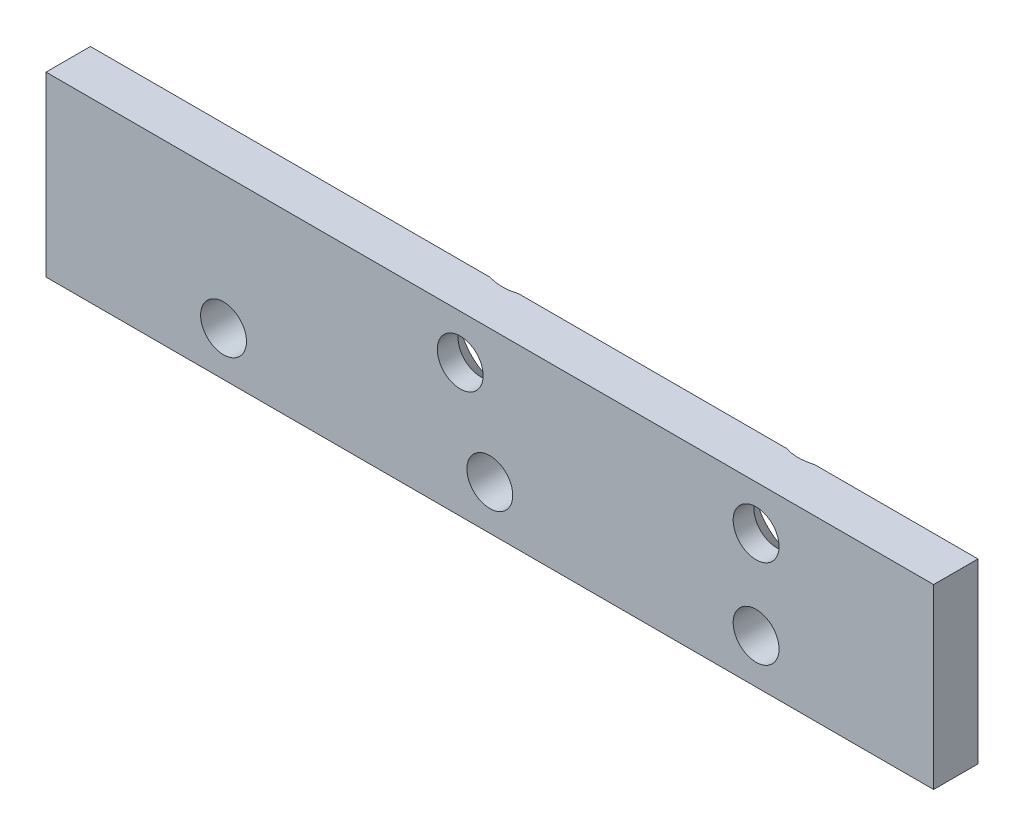
ISO-10303-21;
HEADER;
FILE_DESCRIPTION(('STEP AP214'),'2;1');
FILE_NAME('part.step','',(''),(''),'','','');
FILE_SCHEMA(('AUTOMOTIVE_DESIGN { 1 0 10303 214 1 1 1 1 }'));
ENDSEC;
DATA;
#1=APPLICATION_CONTEXT('core data for automotive mechanical design processes');
#2=APPLICATION_PROTOCOL_DEFINITION('international standard','automotive_design',2000,#1);
#3=PRODUCT_CONTEXT('',#1,'mechanical');
#4=PRODUCT('Part','Part','',(#3));
#5=PRODUCT_RELATED_PRODUCT_CATEGORY('part','',(#4));
#6=PRODUCT_DEFINITION_FORMATION('','',#4);
#7=PRODUCT_DEFINITION_CONTEXT('part definition',#1,'design');
#8=PRODUCT_DEFINITION('design','',#6,#7);
#9=PRODUCT_DEFINITION_SHAPE('','',#8);
#10=(LENGTH_UNIT() NAMED_UNIT(*) SI_UNIT(.MILLI.,.METRE.));
#11=(NAMED_UNIT(*) PLANE_ANGLE_UNIT() SI_UNIT($,.RADIAN.));
#12=(NAMED_UNIT(*) SI_UNIT($,.STERADIAN.) SOLID_ANGLE_UNIT());
#13=UNCERTAINTY_MEASURE_WITH_UNIT(LENGTH_MEASURE(1.E-05),#10,'distance_accuracy_value','');
#14=(GEOMETRIC_REPRESENTATION_CONTEXT(3) GLOBAL_UNCERTAINTY_ASSIGNED_CONTEXT((#13)) GLOBAL_UNIT_ASSIGNED_CONTEXT((#10,
#11,#12)) REPRESENTATION_CONTEXT('',''));
#15=CARTESIAN_POINT('',(0.,0.,0.));
#16=DIRECTION('',(0.,0.,1.));
#17=DIRECTION('',(1.,0.,0.));
#18=AXIS2_PLACEMENT_3D('',#15,#16,#17);
#19=CARTESIAN_POINT('',(0.,0.,3.));
#20=DIRECTION('',(0.,0.,1.));
#21=DIRECTION('',(1.,0.,0.));
#22=AXIS2_PLACEMENT_3D('',#19,#20,#21);
#23=PLANE('',#22);
#24=CARTESIAN_POINT('',(18.,-3.,3.));
#25=DIRECTION('',(0.,0.,1.));
#26=DIRECTION('',(1.,0.,0.));
#27=AXIS2_PLACEMENT_3D('',#24,#25,#26);
#28=CIRCLE('',#27,1.55);
#29=CARTESIAN_POINT('',(19.55,-3.,3.));
#30=VERTEX_POINT('',#29);
#31=EDGE_CURVE('E242',#30,#30,#28,.T.);
#32=ORIENTED_EDGE('',*,*,#31,.F.);
#33=EDGE_LOOP('',(#32));
#34=FACE_BOUND('',#33,.T.);
#35=CARTESIAN_POINT('',(-2.00000000000001,3.,3.));
#36=DIRECTION('',(0.,0.,1.));
#37=DIRECTION('',(1.,0.,0.));
#38=AXIS2_PLACEMENT_3D('',#35,#36,#37);
#39=CIRCLE('',#38,1.55);
#40=CARTESIAN_POINT('',(-0.450000000000005,3.,3.));
#41=VERTEX_POINT('',#40);
#42=EDGE_CURVE('E219',#41,#41,#39,.T.);
#43=ORIENTED_EDGE('',*,*,#42,.F.);
#44=EDGE_LOOP('',(#43));
#45=FACE_BOUND('',#44,.T.);
#46=DIRECTION('',(0.,1.,0.));
#47=VECTOR('',#46,1.);
#48=CARTESIAN_POINT('',(30.,6.,3.));
#49=LINE('',#48,#47);
#50=CARTESIAN_POINT('',(30.,-6.,3.));
#51=VERTEX_POINT('',#50);
#52=CARTESIAN_POINT('',(30.,6.,3.));
#53=VERTEX_POINT('',#52);
#54=EDGE_CURVE('E108',#51,#53,#49,.T.);
#55=ORIENTED_EDGE('',*,*,#54,.T.);
#56=DIRECTION('',(-1.,0.,0.));
#57=VECTOR('',#56,1.);
#58=CARTESIAN_POINT('',(-30.,6.,3.));
#59=LINE('',#58,#57);
#60=CARTESIAN_POINT('',(-30.,6.,3.));
#61=VERTEX_POINT('',#60);
#62=EDGE_CURVE('E95',#53,#61,#59,.T.);
#63=ORIENTED_EDGE('',*,*,#62,.T.);
#64=DIRECTION('',(0.,-1.,0.));
#65=VECTOR('',#64,1.);
#66=CARTESIAN_POINT('',(-30.,6.,3.));
#67=LINE('',#66,#65);
#68=CARTESIAN_POINT('',(-30.,-6.,3.));
#69=VERTEX_POINT('',#68);
#70=EDGE_CURVE('E107',#61,#69,#67,.T.);
#71=ORIENTED_EDGE('',*,*,#70,.T.);
#72=DIRECTION('',(1.,0.,0.));
#73=VECTOR('',#72,1.);
#74=CARTESIAN_POINT('',(-30.,-6.,3.));
#75=LINE('',#74,#73);
#76=EDGE_CURVE('E113',#69,#51,#75,.T.);
#77=ORIENTED_EDGE('',*,*,#76,.T.);
#78=EDGE_LOOP('',(#55,#63,#71,#77));
#79=FACE_BOUND('',#78,.T.);
#80=CARTESIAN_POINT('',(18.,3.,3.));
#81=DIRECTION('',(0.,0.,1.));
#82=DIRECTION('',(1.,0.,0.));
#83=AXIS2_PLACEMENT_3D('',#80,#81,#82);
#84=CIRCLE('',#83,1.55);
#85=CARTESIAN_POINT('',(19.55,3.,3.));
#86=VERTEX_POINT('',#85);
#87=EDGE_CURVE('E212',#86,#86,#84,.T.);
#88=ORIENTED_EDGE('',*,*,#87,.F.);
#89=EDGE_LOOP('',(#88));
#90=FACE_BOUND('',#89,.T.);
#91=CARTESIAN_POINT('',(0.,-3.,3.));
#92=DIRECTION('',(0.,0.,1.));
#93=DIRECTION('',(1.,0.,0.));
#94=AXIS2_PLACEMENT_3D('',#91,#92,#93);
#95=CIRCLE('',#94,1.55);
#96=CARTESIAN_POINT('',(1.54999999999999,-3.,3.));
#97=VERTEX_POINT('',#96);
#98=EDGE_CURVE('E237',#97,#97,#95,.T.);
#99=ORIENTED_EDGE('',*,*,#98,.F.);
#100=EDGE_LOOP('',(#99));
#101=FACE_BOUND('',#100,.T.);
#102=CARTESIAN_POINT('',(-18.,-3.,3.));
#103=DIRECTION('',(0.,0.,1.));
#104=DIRECTION('',(1.,0.,0.));
#105=AXIS2_PLACEMENT_3D('',#102,#103,#104);
#106=CIRCLE('',#105,1.55);
#107=CARTESIAN_POINT('',(-16.45,-3.,3.));
#108=VERTEX_POINT('',#107);
#109=EDGE_CURVE('E250',#108,#108,#106,.T.);
#110=ORIENTED_EDGE('',*,*,#109,.F.);
#111=EDGE_LOOP('',(#110));
#112=FACE_BOUND('',#111,.T.);
#113=ADVANCED_FACE('F41',(#34,#45,#79,#90,#101,#112),#23,.T.);
#114=CARTESIAN_POINT('',(0.,0.,0.));
#115=DIRECTION('',(0.,0.,1.));
#116=DIRECTION('',(1.,0.,0.));
#117=AXIS2_PLACEMENT_3D('',#114,#115,#116);
#118=PLANE('',#117);
#119=DIRECTION('',(-1.,0.,0.));
#120=VECTOR('',#119,1.);
#121=CARTESIAN_POINT('',(-30.,6.,0.));
#122=LINE('',#121,#120);
#123=CARTESIAN_POINT('',(-2.96046863561493,6.,0.));
#124=VERTEX_POINT('',#123);
#125=CARTESIAN_POINT('',(-30.,6.,0.));
#126=VERTEX_POINT('',#125);
#127=EDGE_CURVE('E211',#124,#126,#122,.T.);
#128=ORIENTED_EDGE('',*,*,#127,.F.);
#129=CARTESIAN_POINT('',(-2.00000000000001,3.,0.));
#130=DIRECTION('',(0.,0.,1.));
#131=DIRECTION('',(1.,0.,0.));
#132=AXIS2_PLACEMENT_3D('',#129,#130,#131);
#133=CIRCLE('',#132,3.15);
#134=CARTESIAN_POINT('',(-1.03953136438508,6.,0.));
#135=VERTEX_POINT('',#134);
#136=EDGE_CURVE('E129',#124,#135,#133,.T.);
#137=ORIENTED_EDGE('',*,*,#136,.T.);
#138=CARTESIAN_POINT('',(17.0395313643851,6.,0.));
#139=VERTEX_POINT('',#138);
#140=EDGE_CURVE('E216',#139,#135,#122,.T.);
#141=ORIENTED_EDGE('',*,*,#140,.F.);
#142=CARTESIAN_POINT('',(18.,3.,0.));
#143=DIRECTION('',(0.,0.,1.));
#144=DIRECTION('',(1.,0.,0.));
#145=AXIS2_PLACEMENT_3D('',#142,#143,#144);
#146=CIRCLE('',#145,3.15);
#147=CARTESIAN_POINT('',(18.9604686356149,6.,0.));
#148=VERTEX_POINT('',#147);
#149=EDGE_CURVE('E124',#139,#148,#146,.T.);
#150=ORIENTED_EDGE('',*,*,#149,.T.);
#151=CARTESIAN_POINT('',(30.,6.,0.));
#152=VERTEX_POINT('',#151);
#153=EDGE_CURVE('E209',#152,#148,#122,.T.);
#154=ORIENTED_EDGE('',*,*,#153,.F.);
#155=DIRECTION('',(0.,1.,0.));
#156=VECTOR('',#155,1.);
#157=CARTESIAN_POINT('',(30.,6.,0.));
#158=LINE('',#157,#156);
#159=CARTESIAN_POINT('',(30.,-6.,0.));
#160=VERTEX_POINT('',#159);
#161=EDGE_CURVE('E122',#160,#152,#158,.T.);
#162=ORIENTED_EDGE('',*,*,#161,.F.);
#163=DIRECTION('',(1.,0.,0.));
#164=VECTOR('',#163,1.);
#165=CARTESIAN_POINT('',(-30.,-6.,0.));
#166=LINE('',#165,#164);
#167=CARTESIAN_POINT('',(-30.,-6.,0.));
#168=VERTEX_POINT('',#167);
#169=EDGE_CURVE('E118',#168,#160,#166,.T.);
#170=ORIENTED_EDGE('',*,*,#169,.F.);
#171=DIRECTION('',(0.,-1.,0.));
#172=VECTOR('',#171,1.);
#173=CARTESIAN_POINT('',(-30.,6.,0.));
#174=LINE('',#173,#172);
#175=EDGE_CURVE('E204',#126,#168,#174,.T.);
#176=ORIENTED_EDGE('',*,*,#175,.F.);
#177=EDGE_LOOP('',(#128,#137,#141,#150,#154,#162,#170,#176));
#178=FACE_BOUND('',#177,.T.);
#179=CARTESIAN_POINT('',(0.,-3.,0.));
#180=DIRECTION('',(0.,0.,1.));
#181=DIRECTION('',(1.,0.,0.));
#182=AXIS2_PLACEMENT_3D('',#179,#180,#181);
#183=CIRCLE('',#182,1.55);
#184=CARTESIAN_POINT('',(1.54999999999999,-3.,0.));
#185=VERTEX_POINT('',#184);
#186=EDGE_CURVE('E238',#185,#185,#183,.T.);
#187=ORIENTED_EDGE('',*,*,#186,.T.);
#188=EDGE_LOOP('',(#187));
#189=FACE_BOUND('',#188,.T.);
#190=CARTESIAN_POINT('',(18.,-3.,0.));
#191=DIRECTION('',(0.,0.,1.));
#192=DIRECTION('',(1.,0.,0.));
#193=AXIS2_PLACEMENT_3D('',#190,#191,#192);
#194=CIRCLE('',#193,1.55);
#195=CARTESIAN_POINT('',(19.55,-3.,0.));
#196=VERTEX_POINT('',#195);
#197=EDGE_CURVE('E246',#196,#196,#194,.T.);
#198=ORIENTED_EDGE('',*,*,#197,.T.);
#199=EDGE_LOOP('',(#198));
#200=FACE_BOUND('',#199,.T.);
#201=CARTESIAN_POINT('',(-18.,-3.,0.));
#202=DIRECTION('',(0.,0.,1.));
#203=DIRECTION('',(1.,0.,0.));
#204=AXIS2_PLACEMENT_3D('',#201,#202,#203);
#205=CIRCLE('',#204,1.55);
#206=CARTESIAN_POINT('',(-16.45,-3.,0.));
#207=VERTEX_POINT('',#206);
#208=EDGE_CURVE('E254',#207,#207,#205,.T.);
#209=ORIENTED_EDGE('',*,*,#208,.T.);
#210=EDGE_LOOP('',(#209));
#211=FACE_BOUND('',#210,.T.);
#212=ADVANCED_FACE('F157',(#178,#189,#200,#211),#118,.F.);
#213=CARTESIAN_POINT('',(30.,6.,3.));
#214=DIRECTION('',(-1.,0.,0.));
#215=DIRECTION('',(0.,-1.,0.));
#216=AXIS2_PLACEMENT_3D('',#213,#214,#215);
#217=PLANE('',#216);
#218=ORIENTED_EDGE('',*,*,#161,.T.);
#219=DIRECTION('',(0.,0.,-1.));
#220=VECTOR('',#219,1.);
#221=CARTESIAN_POINT('',(30.,6.,3.));
#222=LINE('',#221,#220);
#223=EDGE_CURVE('E100',#53,#152,#222,.T.);
#224=ORIENTED_EDGE('',*,*,#223,.F.);
#225=ORIENTED_EDGE('',*,*,#54,.F.);
#226=DIRECTION('',(0.,0.,-1.));
#227=VECTOR('',#226,1.);
#228=CARTESIAN_POINT('',(30.,-6.,3.));
#229=LINE('',#228,#227);
#230=EDGE_CURVE('E200',#51,#160,#229,.T.);
#231=ORIENTED_EDGE('',*,*,#230,.T.);
#232=EDGE_LOOP('',(#218,#224,#225,#231));
#233=FACE_BOUND('',#232,.T.);
#234=ADVANCED_FACE('F120',(#233),#217,.F.);
#235=CARTESIAN_POINT('',(-30.,6.,3.));
#236=DIRECTION('',(0.,-1.,0.));
#237=DIRECTION('',(0.,0.,-1.));
#238=AXIS2_PLACEMENT_3D('',#235,#236,#237);
#239=PLANE('',#238);
#240=ORIENTED_EDGE('',*,*,#140,.T.);
#241=CARTESIAN_POINT('',(-1.03953136438508,6.,0.));
#242=CARTESIAN_POINT('',(-1.11476678956564,6.,0.0229582231202239));
#243=CARTESIAN_POINT('',(-1.19072926775713,6.,0.0436587502065245));
#244=CARTESIAN_POINT('',(-1.34393204577362,6.,0.0799978723357718));
#245=CARTESIAN_POINT('',(-1.42117357290103,6.,0.0956312692329639));
#246=CARTESIAN_POINT('',(-1.57485064483564,6.,0.120951552787351));
#247=CARTESIAN_POINT('',(-1.65126508246371,6.,0.130764592575968));
#248=CARTESIAN_POINT('',(-1.80458209103935,6.,0.144610747331857));
#249=CARTESIAN_POINT('',(-1.88148440732652,6.,0.14864666265052));
#250=CARTESIAN_POINT('',(-2.04213378713837,6.,0.150870913103178));
#251=CARTESIAN_POINT('',(-2.12588899019472,6.,0.148514716872752));
#252=CARTESIAN_POINT('',(-2.29296440227771,6.,0.136883205401814));
#253=CARTESIAN_POINT('',(-2.37628429905247,6.,0.127603468636538));
#254=CARTESIAN_POINT('',(-2.54399945705987,6.,0.102230280982151));
#255=CARTESIAN_POINT('',(-2.62836930234745,6.,0.0859718255160318));
#256=CARTESIAN_POINT('',(-2.79560605432925,6.,0.0473673356976593));
#257=CARTESIAN_POINT('',(-2.87847463776743,6.,0.0250286049382429));
#258=CARTESIAN_POINT('',(-2.96046863561493,6.,0.));
#259=B_SPLINE_CURVE_WITH_KNOTS('',3,(#241,#242,#243,#244,#245,#246,#247,#248,#249,#250,#251,
#252,#253,#254,#255,#256,#257,#258),.UNSPECIFIED.,.F.,.F.,(4,2,2,2,2,2,2,2,4),(0.,
0.236000583711202,0.472242509353797,0.703156776316465,0.933959074024975,1.18502586975383,
1.43625313963094,1.69377935481519,1.95099758579074),.UNSPECIFIED.);
#260=EDGE_CURVE('E59',#135,#124,#259,.T.);
#261=ORIENTED_EDGE('',*,*,#260,.T.);
#262=ORIENTED_EDGE('',*,*,#127,.T.);
#263=DIRECTION('',(0.,0.,-1.));
#264=VECTOR('',#263,1.);
#265=CARTESIAN_POINT('',(-30.,6.,3.));
#266=LINE('',#265,#264);
#267=EDGE_CURVE('E103',#61,#126,#266,.T.);
#268=ORIENTED_EDGE('',*,*,#267,.F.);
#269=ORIENTED_EDGE('',*,*,#62,.F.);
#270=ORIENTED_EDGE('',*,*,#223,.T.);
#271=ORIENTED_EDGE('',*,*,#153,.T.);
#272=CARTESIAN_POINT('',(18.9604686356149,6.,0.));
#273=CARTESIAN_POINT('',(18.8852332104344,6.,0.0229582231202232));
#274=CARTESIAN_POINT('',(18.8092707322429,6.,0.0436587502065234));
#275=CARTESIAN_POINT('',(18.6560679542264,6.,0.0799978723357709));
#276=CARTESIAN_POINT('',(18.578826427099,6.,0.0956312692329634));
#277=CARTESIAN_POINT('',(18.4251493551644,6.,0.120951552787351));
#278=CARTESIAN_POINT('',(18.3487349175363,6.,0.130764592575969));
#279=CARTESIAN_POINT('',(18.1954179089607,6.,0.144610747331859));
#280=CARTESIAN_POINT('',(18.1185155926735,6.,0.148646662650522));
#281=CARTESIAN_POINT('',(17.9578662128616,6.,0.15087091310318));
#282=CARTESIAN_POINT('',(17.8741110098053,6.,0.148514716872756));
#283=CARTESIAN_POINT('',(17.7070355977223,6.,0.136883205401817));
#284=CARTESIAN_POINT('',(17.6237157009475,6.,0.127603468636541));
#285=CARTESIAN_POINT('',(17.4560005429401,6.,0.102230280982153));
#286=CARTESIAN_POINT('',(17.3716306976525,6.,0.0859718255160331));
#287=CARTESIAN_POINT('',(17.2043939456707,6.,0.0473673356976593));
#288=CARTESIAN_POINT('',(17.1215253622326,6.,0.0250286049382422));
#289=CARTESIAN_POINT('',(17.0395313643851,6.,0.));
#290=B_SPLINE_CURVE_WITH_KNOTS('',3,(#272,#273,#274,#275,#276,#277,#278,#279,#280,#281,#282,
#283,#284,#285,#286,#287,#288,#289),.UNSPECIFIED.,.F.,.F.,(4,2,2,2,2,2,2,2,4),(0.,
0.236000583711199,0.472242509353797,0.703156776316464,0.933959074024977,1.18502586975384,
1.43625313963095,1.69377935481521,1.95099758579076),.UNSPECIFIED.);
#291=EDGE_CURVE('E137',#148,#139,#290,.T.);
#292=ORIENTED_EDGE('',*,*,#291,.T.);
#293=EDGE_LOOP('',(#240,#261,#262,#268,#269,#270,#271,#292));
#294=FACE_BOUND('',#293,.T.);
#295=ADVANCED_FACE('F97',(#294),#239,.F.);
#296=CARTESIAN_POINT('',(-30.,6.,3.));
#297=DIRECTION('',(1.,0.,0.));
#298=DIRECTION('',(0.,0.,-1.));
#299=AXIS2_PLACEMENT_3D('',#296,#297,#298);
#300=PLANE('',#299);
#301=ORIENTED_EDGE('',*,*,#175,.T.);
#302=DIRECTION('',(0.,0.,-1.));
#303=VECTOR('',#302,1.);
#304=CARTESIAN_POINT('',(-30.,-6.,3.));
#305=LINE('',#304,#303);
#306=EDGE_CURVE('E131',#69,#168,#305,.T.);
#307=ORIENTED_EDGE('',*,*,#306,.F.);
#308=ORIENTED_EDGE('',*,*,#70,.F.);
#309=ORIENTED_EDGE('',*,*,#267,.T.);
#310=EDGE_LOOP('',(#301,#307,#308,#309));
#311=FACE_BOUND('',#310,.T.);
#312=ADVANCED_FACE('F153',(#311),#300,.F.);
#313=CARTESIAN_POINT('',(-30.,-6.,3.));
#314=DIRECTION('',(0.,1.,0.));
#315=DIRECTION('',(0.,0.,1.));
#316=AXIS2_PLACEMENT_3D('',#313,#314,#315);
#317=PLANE('',#316);
#318=ORIENTED_EDGE('',*,*,#169,.T.);
#319=ORIENTED_EDGE('',*,*,#230,.F.);
#320=ORIENTED_EDGE('',*,*,#76,.F.);
#321=ORIENTED_EDGE('',*,*,#306,.T.);
#322=EDGE_LOOP('',(#318,#319,#320,#321));
#323=FACE_BOUND('',#322,.T.);
#324=ADVANCED_FACE('F188',(#323),#317,.F.);
#325=CARTESIAN_POINT('',(18.,3.,3.));
#326=DIRECTION('',(0.,0.,-1.));
#327=DIRECTION('',(-1.,0.,0.));
#328=AXIS2_PLACEMENT_3D('',#325,#326,#327);
#329=CYLINDRICAL_SURFACE('',#328,1.55);
#330=CARTESIAN_POINT('',(18.,3.,1.60000000000001));
#331=DIRECTION('',(0.,0.,1.));
#332=DIRECTION('',(1.,0.,0.));
#333=AXIS2_PLACEMENT_3D('',#330,#331,#332);
#334=CIRCLE('',#333,1.55);
#335=CARTESIAN_POINT('',(19.55,3.,1.60000000000001));
#336=VERTEX_POINT('',#335);
#337=EDGE_CURVE('E11',#336,#336,#334,.F.);
#338=ORIENTED_EDGE('',*,*,#337,.T.);
#339=EDGE_LOOP('',(#338));
#340=FACE_BOUND('',#339,.T.);
#341=ORIENTED_EDGE('',*,*,#87,.T.);
#342=EDGE_LOOP('',(#341));
#343=FACE_BOUND('',#342,.T.);
#344=ADVANCED_FACE('F186',(#340,#343),#329,.F.);
#345=CARTESIAN_POINT('',(-2.00000000000001,3.,3.));
#346=DIRECTION('',(0.,0.,-1.));
#347=DIRECTION('',(-1.,0.,0.));
#348=AXIS2_PLACEMENT_3D('',#345,#346,#347);
#349=CYLINDRICAL_SURFACE('',#348,1.55);
#350=CARTESIAN_POINT('',(-2.00000000000001,3.,1.6));
#351=DIRECTION('',(0.,0.,1.));
#352=DIRECTION('',(1.,0.,0.));
#353=AXIS2_PLACEMENT_3D('',#350,#351,#352);
#354=CIRCLE('',#353,1.55);
#355=CARTESIAN_POINT('',(-0.450000000000005,3.,1.6));
#356=VERTEX_POINT('',#355);
#357=EDGE_CURVE('E52',#356,#356,#354,.F.);
#358=ORIENTED_EDGE('',*,*,#357,.T.);
#359=EDGE_LOOP('',(#358));
#360=FACE_BOUND('',#359,.T.);
#361=ORIENTED_EDGE('',*,*,#42,.T.);
#362=EDGE_LOOP('',(#361));
#363=FACE_BOUND('',#362,.T.);
#364=ADVANCED_FACE('F195',(#360,#363),#349,.F.);
#365=CARTESIAN_POINT('',(0.,-3.,3.));
#366=DIRECTION('',(0.,0.,-1.));
#367=DIRECTION('',(-1.,0.,0.));
#368=AXIS2_PLACEMENT_3D('',#365,#366,#367);
#369=CYLINDRICAL_SURFACE('',#368,1.55);
#370=ORIENTED_EDGE('',*,*,#98,.T.);
#371=EDGE_LOOP('',(#370));
#372=FACE_BOUND('',#371,.T.);
#373=ORIENTED_EDGE('',*,*,#186,.F.);
#374=EDGE_LOOP('',(#373));
#375=FACE_BOUND('',#374,.T.);
#376=ADVANCED_FACE('F268',(#372,#375),#369,.F.);
#377=CARTESIAN_POINT('',(18.,-3.,3.));
#378=DIRECTION('',(0.,0.,-1.));
#379=DIRECTION('',(-1.,0.,0.));
#380=AXIS2_PLACEMENT_3D('',#377,#378,#379);
#381=CYLINDRICAL_SURFACE('',#380,1.55);
#382=ORIENTED_EDGE('',*,*,#31,.T.);
#383=EDGE_LOOP('',(#382));
#384=FACE_BOUND('',#383,.T.);
#385=ORIENTED_EDGE('',*,*,#197,.F.);
#386=EDGE_LOOP('',(#385));
#387=FACE_BOUND('',#386,.T.);
#388=ADVANCED_FACE('F171',(#384,#387),#381,.F.);
#389=CARTESIAN_POINT('',(-18.,-3.,3.));
#390=DIRECTION('',(0.,0.,-1.));
#391=DIRECTION('',(-1.,0.,0.));
#392=AXIS2_PLACEMENT_3D('',#389,#390,#391);
#393=CYLINDRICAL_SURFACE('',#392,1.55);
#394=ORIENTED_EDGE('',*,*,#109,.T.);
#395=EDGE_LOOP('',(#394));
#396=FACE_BOUND('',#395,.T.);
#397=ORIENTED_EDGE('',*,*,#208,.F.);
#398=EDGE_LOOP('',(#397));
#399=FACE_BOUND('',#398,.T.);
#400=ADVANCED_FACE('F164',(#396,#399),#393,.F.);
#401=CARTESIAN_POINT('',(-2.00000000000001,3.,0.));
#402=DIRECTION('',(0.,0.,-1.));
#403=DIRECTION('',(-1.,0.,0.));
#404=AXIS2_PLACEMENT_3D('',#401,#402,#403);
#405=CONICAL_SURFACE('',#404,3.15,0.785398163397448);
#406=ORIENTED_EDGE('',*,*,#357,.F.);
#407=EDGE_LOOP('',(#406));
#408=FACE_BOUND('',#407,.T.);
#409=ORIENTED_EDGE('',*,*,#260,.F.);
#410=ORIENTED_EDGE('',*,*,#136,.F.);
#411=EDGE_LOOP('',(#409,#410));
#412=FACE_BOUND('',#411,.T.);
#413=ADVANCED_FACE('F159',(#408,#412),#405,.F.);
#414=CARTESIAN_POINT('',(18.,3.,0.));
#415=DIRECTION('',(0.,0.,-1.));
#416=DIRECTION('',(-1.,0.,0.));
#417=AXIS2_PLACEMENT_3D('',#414,#415,#416);
#418=CONICAL_SURFACE('',#417,3.15,0.785398163397447);
#419=ORIENTED_EDGE('',*,*,#337,.F.);
#420=EDGE_LOOP('',(#419));
#421=FACE_BOUND('',#420,.T.);
#422=ORIENTED_EDGE('',*,*,#291,.F.);
#423=ORIENTED_EDGE('',*,*,#149,.F.);
#424=EDGE_LOOP('',(#422,#423));
#425=FACE_BOUND('',#424,.T.);
#426=ADVANCED_FACE('F44',(#421,#425),#418,.F.);
#427=CLOSED_SHELL('',(#113,#212,#234,#295,#312,#324,#344,#364,#376,#388,#400,#413,#426));
#428=MANIFOLD_SOLID_BREP('B2',#427);
#429=ADVANCED_BREP_SHAPE_REPRESENTATION('',(#18,#428),#14);
#430=SHAPE_DEFINITION_REPRESENTATION(#9,#429);
ENDSEC;
END-ISO-10303-21;
